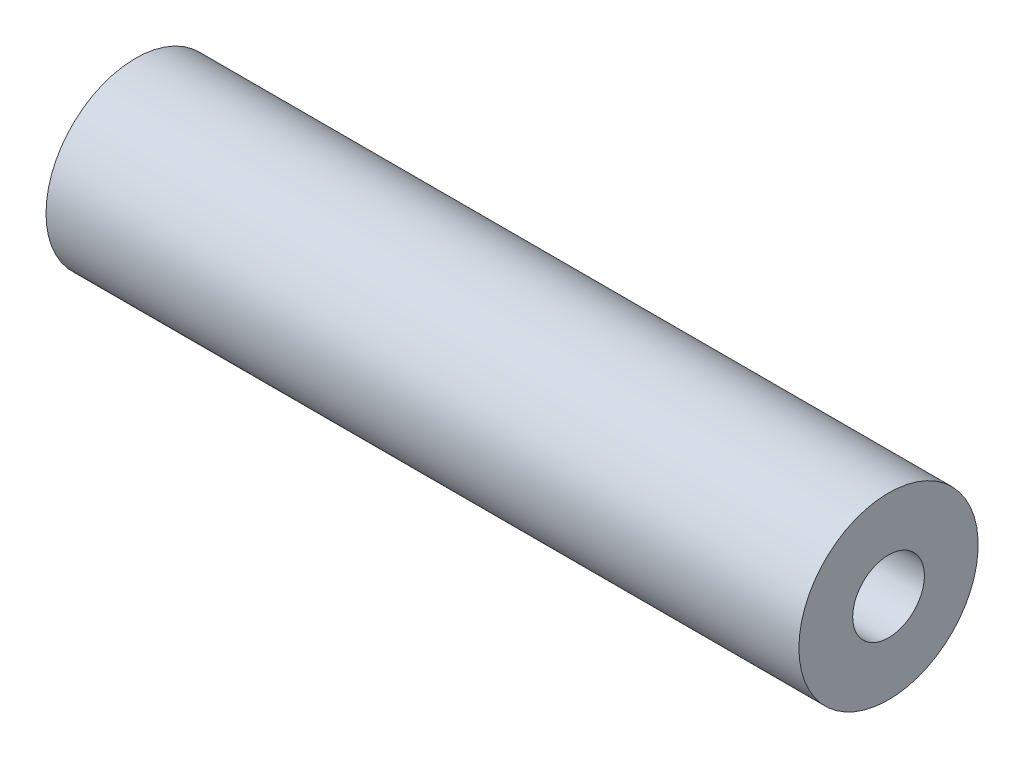
ISO-10303-21;
HEADER;
FILE_DESCRIPTION(('STEP AP214'),'2;1');
FILE_NAME('part.step','',(''),(''),'','','');
FILE_SCHEMA(('AUTOMOTIVE_DESIGN { 1 0 10303 214 1 1 1 1 }'));
ENDSEC;
DATA;
#1=APPLICATION_CONTEXT('core data for automotive mechanical design processes');
#2=APPLICATION_PROTOCOL_DEFINITION('international standard','automotive_design',2000,#1);
#3=PRODUCT_CONTEXT('',#1,'mechanical');
#4=PRODUCT('Part','Part','',(#3));
#5=PRODUCT_RELATED_PRODUCT_CATEGORY('part','',(#4));
#6=PRODUCT_DEFINITION_FORMATION('','',#4);
#7=PRODUCT_DEFINITION_CONTEXT('part definition',#1,'design');
#8=PRODUCT_DEFINITION('design','',#6,#7);
#9=PRODUCT_DEFINITION_SHAPE('','',#8);
#10=(LENGTH_UNIT() NAMED_UNIT(*) SI_UNIT(.MILLI.,.METRE.));
#11=(NAMED_UNIT(*) PLANE_ANGLE_UNIT() SI_UNIT($,.RADIAN.));
#12=(NAMED_UNIT(*) SI_UNIT($,.STERADIAN.) SOLID_ANGLE_UNIT());
#13=UNCERTAINTY_MEASURE_WITH_UNIT(LENGTH_MEASURE(1.E-05),#10,'distance_accuracy_value','');
#14=(GEOMETRIC_REPRESENTATION_CONTEXT(3) GLOBAL_UNCERTAINTY_ASSIGNED_CONTEXT((#13)) GLOBAL_UNIT_ASSIGNED_CONTEXT((#10,
#11,#12)) REPRESENTATION_CONTEXT('',''));
#15=CARTESIAN_POINT('',(0.,0.,0.));
#16=DIRECTION('',(0.,0.,1.));
#17=DIRECTION('',(1.,0.,0.));
#18=AXIS2_PLACEMENT_3D('',#15,#16,#17);
#19=CARTESIAN_POINT('',(21.,0.,0.));
#20=DIRECTION('',(1.,0.,0.));
#21=DIRECTION('',(0.,0.,-1.));
#22=AXIS2_PLACEMENT_3D('',#19,#20,#21);
#23=PLANE('',#22);
#24=CARTESIAN_POINT('',(21.,0.,0.));
#25=DIRECTION('',(1.,0.,0.));
#26=DIRECTION('',(0.,0.,-1.));
#27=AXIS2_PLACEMENT_3D('',#24,#25,#26);
#28=CIRCLE('',#27,5.);
#29=CARTESIAN_POINT('',(21.,0.,5.));
#30=VERTEX_POINT('',#29);
#31=EDGE_CURVE('E10',#30,#30,#28,.T.);
#32=ORIENTED_EDGE('',*,*,#31,.T.);
#33=EDGE_LOOP('',(#32));
#34=FACE_BOUND('',#33,.T.);
#35=CARTESIAN_POINT('',(21.,0.,0.));
#36=DIRECTION('',(1.,0.,0.));
#37=DIRECTION('',(0.,0.,-1.));
#38=AXIS2_PLACEMENT_3D('',#35,#36,#37);
#39=CIRCLE('',#38,2.);
#40=CARTESIAN_POINT('',(21.,0.,2.));
#41=VERTEX_POINT('',#40);
#42=EDGE_CURVE('E44',#41,#41,#39,.T.);
#43=ORIENTED_EDGE('',*,*,#42,.F.);
#44=EDGE_LOOP('',(#43));
#45=FACE_BOUND('',#44,.T.);
#46=ADVANCED_FACE('F33',(#34,#45),#23,.T.);
#47=CARTESIAN_POINT('',(-21.,0.,0.));
#48=DIRECTION('',(1.,0.,0.));
#49=DIRECTION('',(0.,0.,-1.));
#50=AXIS2_PLACEMENT_3D('',#47,#48,#49);
#51=PLANE('',#50);
#52=CARTESIAN_POINT('',(-21.,0.,0.));
#53=DIRECTION('',(1.,0.,0.));
#54=DIRECTION('',(0.,0.,-1.));
#55=AXIS2_PLACEMENT_3D('',#52,#53,#54);
#56=CIRCLE('',#55,5.);
#57=CARTESIAN_POINT('',(-21.,0.,5.));
#58=VERTEX_POINT('',#57);
#59=EDGE_CURVE('E37',#58,#58,#56,.T.);
#60=ORIENTED_EDGE('',*,*,#59,.F.);
#61=EDGE_LOOP('',(#60));
#62=FACE_BOUND('',#61,.T.);
#63=CARTESIAN_POINT('',(-21.,0.,0.));
#64=DIRECTION('',(1.,0.,0.));
#65=DIRECTION('',(0.,0.,-1.));
#66=AXIS2_PLACEMENT_3D('',#63,#64,#65);
#67=CIRCLE('',#66,2.);
#68=CARTESIAN_POINT('',(-21.,0.,2.));
#69=VERTEX_POINT('',#68);
#70=EDGE_CURVE('E46',#69,#69,#67,.T.);
#71=ORIENTED_EDGE('',*,*,#70,.T.);
#72=EDGE_LOOP('',(#71));
#73=FACE_BOUND('',#72,.T.);
#74=ADVANCED_FACE('F56',(#62,#73),#51,.F.);
#75=CARTESIAN_POINT('',(21.,0.,0.));
#76=DIRECTION('',(-1.,0.,0.));
#77=DIRECTION('',(0.,0.,1.));
#78=AXIS2_PLACEMENT_3D('',#75,#76,#77);
#79=CYLINDRICAL_SURFACE('',#78,5.);
#80=CARTESIAN_POINT('',(21.,0.,5.));
#81=CARTESIAN_POINT('',(20.5625,0.,5.));
#82=CARTESIAN_POINT('',(20.125,0.,5.));
#83=CARTESIAN_POINT('',(19.25,0.,5.));
#84=CARTESIAN_POINT('',(18.8125,0.,5.));
#85=CARTESIAN_POINT('',(17.9375,0.,5.));
#86=CARTESIAN_POINT('',(17.5,0.,5.));
#87=CARTESIAN_POINT('',(16.625,0.,5.));
#88=CARTESIAN_POINT('',(16.1875,0.,5.));
#89=CARTESIAN_POINT('',(15.3125,0.,5.));
#90=CARTESIAN_POINT('',(14.875,0.,5.));
#91=CARTESIAN_POINT('',(14.,0.,5.));
#92=CARTESIAN_POINT('',(13.5625,0.,5.));
#93=CARTESIAN_POINT('',(12.6875,0.,5.));
#94=CARTESIAN_POINT('',(12.25,0.,5.));
#95=CARTESIAN_POINT('',(11.375,0.,5.));
#96=CARTESIAN_POINT('',(10.9375,0.,5.));
#97=CARTESIAN_POINT('',(10.0625,0.,5.));
#98=CARTESIAN_POINT('',(9.625,0.,5.));
#99=CARTESIAN_POINT('',(8.75,0.,5.));
#100=CARTESIAN_POINT('',(8.3125,0.,5.));
#101=CARTESIAN_POINT('',(7.4375,0.,5.));
#102=CARTESIAN_POINT('',(7.,0.,5.));
#103=CARTESIAN_POINT('',(6.125,0.,5.));
#104=CARTESIAN_POINT('',(5.6875,0.,5.));
#105=CARTESIAN_POINT('',(4.8125,0.,5.));
#106=CARTESIAN_POINT('',(4.375,0.,5.));
#107=CARTESIAN_POINT('',(3.5,0.,5.));
#108=CARTESIAN_POINT('',(3.0625,0.,5.));
#109=CARTESIAN_POINT('',(2.1875,0.,5.));
#110=CARTESIAN_POINT('',(1.75,0.,5.));
#111=CARTESIAN_POINT('',(0.875000000000001,0.,5.));
#112=CARTESIAN_POINT('',(0.4375,0.,5.));
#113=CARTESIAN_POINT('',(-0.4375,0.,5.));
#114=CARTESIAN_POINT('',(-0.875000000000001,0.,5.));
#115=CARTESIAN_POINT('',(-1.75,0.,5.));
#116=CARTESIAN_POINT('',(-2.1875,0.,5.));
#117=CARTESIAN_POINT('',(-3.0625,0.,5.));
#118=CARTESIAN_POINT('',(-3.5,0.,5.));
#119=CARTESIAN_POINT('',(-4.375,0.,5.));
#120=CARTESIAN_POINT('',(-4.8125,0.,5.));
#121=CARTESIAN_POINT('',(-5.6875,0.,5.));
#122=CARTESIAN_POINT('',(-6.125,0.,5.));
#123=CARTESIAN_POINT('',(-7.,0.,5.));
#124=CARTESIAN_POINT('',(-7.4375,0.,5.));
#125=CARTESIAN_POINT('',(-8.3125,0.,5.));
#126=CARTESIAN_POINT('',(-8.75,0.,5.));
#127=CARTESIAN_POINT('',(-9.625,0.,5.));
#128=CARTESIAN_POINT('',(-10.0625,0.,5.));
#129=CARTESIAN_POINT('',(-10.9375,0.,5.));
#130=CARTESIAN_POINT('',(-11.375,0.,5.));
#131=CARTESIAN_POINT('',(-12.25,0.,5.));
#132=CARTESIAN_POINT('',(-12.6875,0.,5.));
#133=CARTESIAN_POINT('',(-13.5625,0.,5.));
#134=CARTESIAN_POINT('',(-14.,0.,5.));
#135=CARTESIAN_POINT('',(-14.875,0.,5.));
#136=CARTESIAN_POINT('',(-15.3125,0.,5.));
#137=CARTESIAN_POINT('',(-16.1875,0.,5.));
#138=CARTESIAN_POINT('',(-16.625,0.,5.));
#139=CARTESIAN_POINT('',(-17.5,0.,5.));
#140=CARTESIAN_POINT('',(-17.9375,0.,5.));
#141=CARTESIAN_POINT('',(-18.8125,0.,5.));
#142=CARTESIAN_POINT('',(-19.25,0.,5.));
#143=CARTESIAN_POINT('',(-20.125,0.,5.));
#144=CARTESIAN_POINT('',(-20.5625,0.,5.));
#145=CARTESIAN_POINT('',(-21.,0.,5.));
#146=B_SPLINE_CURVE_WITH_KNOTS('',3,(#80,#81,#82,#83,#84,#85,#86,#87,#88,#89,#90,#91,#92,#93,
#94,#95,#96,#97,#98,#99,#100,#101,#102,#103,#104,#105,#106,#107,#108,#109,#110,#111,#112,#113,
#114,#115,#116,#117,#118,#119,#120,#121,#122,#123,#124,#125,#126,#127,#128,#129,#130,#131,#132,
#133,#134,#135,#136,#137,#138,#139,#140,#141,#142,#143,#144,#145),.UNSPECIFIED.,.F.,.F.,(4,2,2,
2,2,2,2,2,2,2,2,2,2,2,2,2,2,2,2,2,2,2,2,2,2,2,2,2,2,2,2,2,4),(0.,1.3125,2.625,3.9375,5.25,
6.5625,7.875,9.1875,10.5,11.8125,13.125,14.4375,15.75,17.0625,18.375,19.6875,21.,22.3125,23.625,
24.9375,26.25,27.5625,28.875,30.1875,31.5,32.8125,34.125,35.4375,36.75,38.0625,39.375,40.6875,
42.),.UNSPECIFIED.);
#147=EDGE_CURVE('BSEAM35',#30,#58,#146,.T.);
#148=ORIENTED_EDGE('',*,*,#31,.F.);
#149=ORIENTED_EDGE('',*,*,#59,.T.);
#150=ORIENTED_EDGE('',*,*,#147,.T.);
#151=ORIENTED_EDGE('',*,*,#147,.F.);
#152=EDGE_LOOP('',(#148,#150,#149,#151));
#153=FACE_BOUND('',#152,.T.);
#154=ADVANCED_FACE('F35',(#153),#79,.T.);
#155=CARTESIAN_POINT('',(21.,0.,0.));
#156=DIRECTION('',(-1.,0.,0.));
#157=DIRECTION('',(0.,0.,1.));
#158=AXIS2_PLACEMENT_3D('',#155,#156,#157);
#159=CYLINDRICAL_SURFACE('',#158,2.);
#160=CARTESIAN_POINT('',(21.,0.,2.));
#161=CARTESIAN_POINT('',(20.5625,0.,2.));
#162=CARTESIAN_POINT('',(20.125,0.,2.));
#163=CARTESIAN_POINT('',(19.25,0.,2.));
#164=CARTESIAN_POINT('',(18.8125,0.,2.));
#165=CARTESIAN_POINT('',(17.9375,0.,2.));
#166=CARTESIAN_POINT('',(17.5,0.,2.));
#167=CARTESIAN_POINT('',(16.625,0.,2.));
#168=CARTESIAN_POINT('',(16.1875,0.,2.));
#169=CARTESIAN_POINT('',(15.3125,0.,2.));
#170=CARTESIAN_POINT('',(14.875,0.,2.));
#171=CARTESIAN_POINT('',(14.,0.,2.));
#172=CARTESIAN_POINT('',(13.5625,0.,2.));
#173=CARTESIAN_POINT('',(12.6875,0.,2.));
#174=CARTESIAN_POINT('',(12.25,0.,2.));
#175=CARTESIAN_POINT('',(11.375,0.,2.));
#176=CARTESIAN_POINT('',(10.9375,0.,2.));
#177=CARTESIAN_POINT('',(10.0625,0.,2.));
#178=CARTESIAN_POINT('',(9.625,0.,2.));
#179=CARTESIAN_POINT('',(8.75,0.,2.));
#180=CARTESIAN_POINT('',(8.3125,0.,2.));
#181=CARTESIAN_POINT('',(7.4375,0.,2.));
#182=CARTESIAN_POINT('',(7.,0.,2.));
#183=CARTESIAN_POINT('',(6.125,0.,2.));
#184=CARTESIAN_POINT('',(5.6875,0.,2.));
#185=CARTESIAN_POINT('',(4.8125,0.,2.));
#186=CARTESIAN_POINT('',(4.375,0.,2.));
#187=CARTESIAN_POINT('',(3.5,0.,2.));
#188=CARTESIAN_POINT('',(3.0625,0.,2.));
#189=CARTESIAN_POINT('',(2.1875,0.,2.));
#190=CARTESIAN_POINT('',(1.75,0.,2.));
#191=CARTESIAN_POINT('',(0.874999999999997,0.,2.));
#192=CARTESIAN_POINT('',(0.437499999999997,0.,2.));
#193=CARTESIAN_POINT('',(-0.437500000000004,0.,2.));
#194=CARTESIAN_POINT('',(-0.875000000000004,0.,2.));
#195=CARTESIAN_POINT('',(-1.75000000000001,0.,2.));
#196=CARTESIAN_POINT('',(-2.18750000000001,0.,2.));
#197=CARTESIAN_POINT('',(-3.0625,0.,2.));
#198=CARTESIAN_POINT('',(-3.5,0.,2.));
#199=CARTESIAN_POINT('',(-4.375,0.,2.));
#200=CARTESIAN_POINT('',(-4.8125,0.,2.));
#201=CARTESIAN_POINT('',(-5.68750000000001,0.,2.));
#202=CARTESIAN_POINT('',(-6.12500000000001,0.,2.));
#203=CARTESIAN_POINT('',(-7.00000000000001,0.,2.));
#204=CARTESIAN_POINT('',(-7.4375,0.,2.));
#205=CARTESIAN_POINT('',(-8.3125,0.,2.));
#206=CARTESIAN_POINT('',(-8.75,0.,2.));
#207=CARTESIAN_POINT('',(-9.625,0.,2.));
#208=CARTESIAN_POINT('',(-10.0625,0.,2.));
#209=CARTESIAN_POINT('',(-10.9375,0.,2.));
#210=CARTESIAN_POINT('',(-11.375,0.,2.));
#211=CARTESIAN_POINT('',(-12.25,0.,2.));
#212=CARTESIAN_POINT('',(-12.6875,0.,2.));
#213=CARTESIAN_POINT('',(-13.5625,0.,2.));
#214=CARTESIAN_POINT('',(-14.,0.,2.));
#215=CARTESIAN_POINT('',(-14.875,0.,2.));
#216=CARTESIAN_POINT('',(-15.3125,0.,2.));
#217=CARTESIAN_POINT('',(-16.1875,0.,2.));
#218=CARTESIAN_POINT('',(-16.625,0.,2.));
#219=CARTESIAN_POINT('',(-17.5,0.,2.));
#220=CARTESIAN_POINT('',(-17.9375,0.,2.));
#221=CARTESIAN_POINT('',(-18.8125,0.,2.));
#222=CARTESIAN_POINT('',(-19.25,0.,2.));
#223=CARTESIAN_POINT('',(-20.125,0.,2.));
#224=CARTESIAN_POINT('',(-20.5625,0.,2.));
#225=CARTESIAN_POINT('',(-21.,0.,2.));
#226=B_SPLINE_CURVE_WITH_KNOTS('',3,(#160,#161,#162,#163,#164,#165,#166,#167,#168,#169,#170,
#171,#172,#173,#174,#175,#176,#177,#178,#179,#180,#181,#182,#183,#184,#185,#186,#187,#188,#189,
#190,#191,#192,#193,#194,#195,#196,#197,#198,#199,#200,#201,#202,#203,#204,#205,#206,#207,#208,
#209,#210,#211,#212,#213,#214,#215,#216,#217,#218,#219,#220,#221,#222,#223,#224,#225),
.UNSPECIFIED.,.F.,.F.,(4,2,2,2,2,2,2,2,2,2,2,2,2,2,2,2,2,2,2,2,2,2,2,2,2,2,2,2,2,2,2,2,4),(0.,
1.3125,2.625,3.9375,5.25,6.5625,7.875,9.1875,10.5,11.8125,13.125,14.4375,15.75,17.0625,18.375,
19.6875,21.,22.3125,23.625,24.9375,26.25,27.5625,28.875,30.1875,31.5,32.8125,34.125,35.4375,
36.75,38.0625,39.375,40.6875,42.),.UNSPECIFIED.);
#227=EDGE_CURVE('BSEAM52',#41,#69,#226,.T.);
#228=ORIENTED_EDGE('',*,*,#42,.T.);
#229=ORIENTED_EDGE('',*,*,#70,.F.);
#230=ORIENTED_EDGE('',*,*,#227,.T.);
#231=ORIENTED_EDGE('',*,*,#227,.F.);
#232=EDGE_LOOP('',(#228,#230,#229,#231));
#233=FACE_BOUND('',#232,.T.);
#234=ADVANCED_FACE('F52',(#233),#159,.F.);
#235=CLOSED_SHELL('',(#46,#74,#154,#234));
#236=MANIFOLD_SOLID_BREP('B2',#235);
#237=ADVANCED_BREP_SHAPE_REPRESENTATION('',(#18,#236),#14);
#238=SHAPE_DEFINITION_REPRESENTATION(#9,#237);
ENDSEC;
END-ISO-10303-21;
